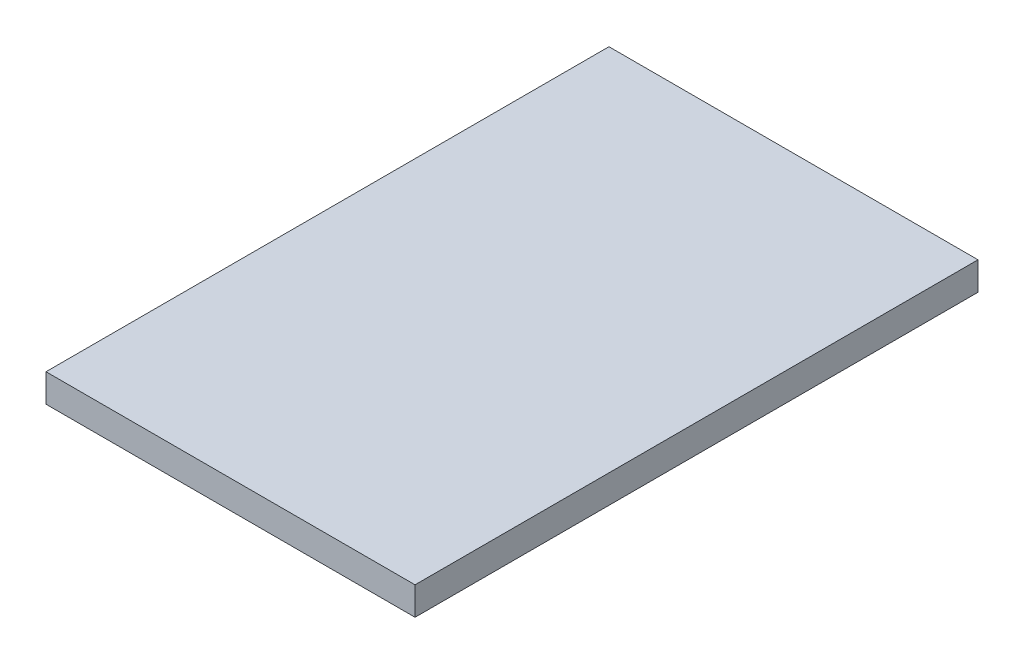
ISO-10303-21;
HEADER;
FILE_DESCRIPTION(('STEP AP214'),'2;1');
FILE_NAME('part.step','',(''),(''),'','','');
FILE_SCHEMA(('AUTOMOTIVE_DESIGN { 1 0 10303 214 1 1 1 1 }'));
ENDSEC;
DATA;
#1=APPLICATION_CONTEXT('core data for automotive mechanical design processes');
#2=APPLICATION_PROTOCOL_DEFINITION('international standard','automotive_design',2000,#1);
#3=PRODUCT_CONTEXT('',#1,'mechanical');
#4=PRODUCT('Part','Part','',(#3));
#5=PRODUCT_RELATED_PRODUCT_CATEGORY('part','',(#4));
#6=PRODUCT_DEFINITION_FORMATION('','',#4);
#7=PRODUCT_DEFINITION_CONTEXT('part definition',#1,'design');
#8=PRODUCT_DEFINITION('design','',#6,#7);
#9=PRODUCT_DEFINITION_SHAPE('','',#8);
#10=(LENGTH_UNIT() NAMED_UNIT(*) SI_UNIT(.MILLI.,.METRE.));
#11=(NAMED_UNIT(*) PLANE_ANGLE_UNIT() SI_UNIT($,.RADIAN.));
#12=(NAMED_UNIT(*) SI_UNIT($,.STERADIAN.) SOLID_ANGLE_UNIT());
#13=UNCERTAINTY_MEASURE_WITH_UNIT(LENGTH_MEASURE(1.E-05),#10,'distance_accuracy_value','');
#14=(GEOMETRIC_REPRESENTATION_CONTEXT(3) GLOBAL_UNCERTAINTY_ASSIGNED_CONTEXT((#13)) GLOBAL_UNIT_ASSIGNED_CONTEXT((#10,
#11,#12)) REPRESENTATION_CONTEXT('',''));
#15=CARTESIAN_POINT('',(0.,0.,0.));
#16=DIRECTION('',(0.,0.,1.));
#17=DIRECTION('',(1.,0.,0.));
#18=AXIS2_PLACEMENT_3D('',#15,#16,#17);
#19=CARTESIAN_POINT('',(118.,18.,-180.));
#20=DIRECTION('',(-1.,0.,0.));
#21=DIRECTION('',(0.,0.,1.));
#22=AXIS2_PLACEMENT_3D('',#19,#20,#21);
#23=PLANE('',#22);
#24=DIRECTION('',(0.,0.,-1.));
#25=VECTOR('',#24,1.);
#26=CARTESIAN_POINT('',(118.,0.,-180.));
#27=LINE('',#26,#25);
#28=CARTESIAN_POINT('',(118.,0.,180.));
#29=VERTEX_POINT('',#28);
#30=CARTESIAN_POINT('',(118.,0.,-180.));
#31=VERTEX_POINT('',#30);
#32=EDGE_CURVE('E95',#29,#31,#27,.T.);
#33=ORIENTED_EDGE('',*,*,#32,.T.);
#34=DIRECTION('',(0.,-1.,0.));
#35=VECTOR('',#34,1.);
#36=CARTESIAN_POINT('',(118.,18.,-180.));
#37=LINE('',#36,#35);
#38=CARTESIAN_POINT('',(118.,18.,-180.));
#39=VERTEX_POINT('',#38);
#40=EDGE_CURVE('E11',#39,#31,#37,.T.);
#41=ORIENTED_EDGE('',*,*,#40,.F.);
#42=DIRECTION('',(0.,0.,-1.));
#43=VECTOR('',#42,1.);
#44=CARTESIAN_POINT('',(118.,18.,-180.));
#45=LINE('',#44,#43);
#46=CARTESIAN_POINT('',(118.,18.,180.));
#47=VERTEX_POINT('',#46);
#48=EDGE_CURVE('E83',#47,#39,#45,.T.);
#49=ORIENTED_EDGE('',*,*,#48,.F.);
#50=DIRECTION('',(0.,-1.,0.));
#51=VECTOR('',#50,1.);
#52=CARTESIAN_POINT('',(118.,18.,180.));
#53=LINE('',#52,#51);
#54=EDGE_CURVE('E91',#47,#29,#53,.T.);
#55=ORIENTED_EDGE('',*,*,#54,.T.);
#56=EDGE_LOOP('',(#33,#41,#49,#55));
#57=FACE_BOUND('',#56,.T.);
#58=ADVANCED_FACE('F32',(#57),#23,.F.);
#59=CARTESIAN_POINT('',(-118.,18.,-180.));
#60=DIRECTION('',(0.,0.,1.));
#61=DIRECTION('',(1.,0.,0.));
#62=AXIS2_PLACEMENT_3D('',#59,#60,#61);
#63=PLANE('',#62);
#64=DIRECTION('',(-1.,0.,0.));
#65=VECTOR('',#64,1.);
#66=CARTESIAN_POINT('',(-118.,0.,-180.));
#67=LINE('',#66,#65);
#68=CARTESIAN_POINT('',(-118.,0.,-180.));
#69=VERTEX_POINT('',#68);
#70=EDGE_CURVE('E87',#31,#69,#67,.T.);
#71=ORIENTED_EDGE('',*,*,#70,.T.);
#72=DIRECTION('',(0.,-1.,0.));
#73=VECTOR('',#72,1.);
#74=CARTESIAN_POINT('',(-118.,18.,-180.));
#75=LINE('',#74,#73);
#76=CARTESIAN_POINT('',(-118.,18.,-180.));
#77=VERTEX_POINT('',#76);
#78=EDGE_CURVE('E40',#77,#69,#75,.T.);
#79=ORIENTED_EDGE('',*,*,#78,.F.);
#80=DIRECTION('',(-1.,0.,0.));
#81=VECTOR('',#80,1.);
#82=CARTESIAN_POINT('',(-118.,18.,-180.));
#83=LINE('',#82,#81);
#84=EDGE_CURVE('E78',#39,#77,#83,.T.);
#85=ORIENTED_EDGE('',*,*,#84,.F.);
#86=ORIENTED_EDGE('',*,*,#40,.T.);
#87=EDGE_LOOP('',(#71,#79,#85,#86));
#88=FACE_BOUND('',#87,.T.);
#89=ADVANCED_FACE('F86',(#88),#63,.F.);
#90=CARTESIAN_POINT('',(-118.,18.,-180.));
#91=DIRECTION('',(1.,0.,0.));
#92=DIRECTION('',(0.,0.,-1.));
#93=AXIS2_PLACEMENT_3D('',#90,#91,#92);
#94=PLANE('',#93);
#95=DIRECTION('',(0.,0.,1.));
#96=VECTOR('',#95,1.);
#97=CARTESIAN_POINT('',(-118.,0.,-180.));
#98=LINE('',#97,#96);
#99=CARTESIAN_POINT('',(-118.,0.,180.));
#100=VERTEX_POINT('',#99);
#101=EDGE_CURVE('E65',#69,#100,#98,.T.);
#102=ORIENTED_EDGE('',*,*,#101,.T.);
#103=DIRECTION('',(0.,-1.,0.));
#104=VECTOR('',#103,1.);
#105=CARTESIAN_POINT('',(-118.,18.,180.));
#106=LINE('',#105,#104);
#107=CARTESIAN_POINT('',(-118.,18.,180.));
#108=VERTEX_POINT('',#107);
#109=EDGE_CURVE('E88',#108,#100,#106,.T.);
#110=ORIENTED_EDGE('',*,*,#109,.F.);
#111=DIRECTION('',(0.,0.,1.));
#112=VECTOR('',#111,1.);
#113=CARTESIAN_POINT('',(-118.,18.,-180.));
#114=LINE('',#113,#112);
#115=EDGE_CURVE('E81',#77,#108,#114,.T.);
#116=ORIENTED_EDGE('',*,*,#115,.F.);
#117=ORIENTED_EDGE('',*,*,#78,.T.);
#118=EDGE_LOOP('',(#102,#110,#116,#117));
#119=FACE_BOUND('',#118,.T.);
#120=ADVANCED_FACE('F89',(#119),#94,.F.);
#121=CARTESIAN_POINT('',(-118.,18.,180.));
#122=DIRECTION('',(0.,0.,-1.));
#123=DIRECTION('',(-1.,0.,0.));
#124=AXIS2_PLACEMENT_3D('',#121,#122,#123);
#125=PLANE('',#124);
#126=DIRECTION('',(1.,0.,0.));
#127=VECTOR('',#126,1.);
#128=CARTESIAN_POINT('',(-118.,0.,180.));
#129=LINE('',#128,#127);
#130=EDGE_CURVE('E71',#100,#29,#129,.T.);
#131=ORIENTED_EDGE('',*,*,#130,.T.);
#132=ORIENTED_EDGE('',*,*,#54,.F.);
#133=DIRECTION('',(1.,0.,0.));
#134=VECTOR('',#133,1.);
#135=CARTESIAN_POINT('',(-118.,18.,180.));
#136=LINE('',#135,#134);
#137=EDGE_CURVE('E48',#108,#47,#136,.T.);
#138=ORIENTED_EDGE('',*,*,#137,.F.);
#139=ORIENTED_EDGE('',*,*,#109,.T.);
#140=EDGE_LOOP('',(#131,#132,#138,#139));
#141=FACE_BOUND('',#140,.T.);
#142=ADVANCED_FACE('F102',(#141),#125,.F.);
#143=CARTESIAN_POINT('',(0.,18.,0.));
#144=DIRECTION('',(0.,1.,0.));
#145=DIRECTION('',(0.,0.,1.));
#146=AXIS2_PLACEMENT_3D('',#143,#144,#145);
#147=PLANE('',#146);
#148=ORIENTED_EDGE('',*,*,#48,.T.);
#149=ORIENTED_EDGE('',*,*,#84,.T.);
#150=ORIENTED_EDGE('',*,*,#115,.T.);
#151=ORIENTED_EDGE('',*,*,#137,.T.);
#152=EDGE_LOOP('',(#148,#149,#150,#151));
#153=FACE_BOUND('',#152,.T.);
#154=ADVANCED_FACE('F79',(#153),#147,.T.);
#155=CARTESIAN_POINT('',(0.,0.,0.));
#156=DIRECTION('',(0.,1.,0.));
#157=DIRECTION('',(0.,0.,1.));
#158=AXIS2_PLACEMENT_3D('',#155,#156,#157);
#159=PLANE('',#158);
#160=ORIENTED_EDGE('',*,*,#32,.F.);
#161=ORIENTED_EDGE('',*,*,#130,.F.);
#162=ORIENTED_EDGE('',*,*,#101,.F.);
#163=ORIENTED_EDGE('',*,*,#70,.F.);
#164=EDGE_LOOP('',(#160,#161,#162,#163));
#165=FACE_BOUND('',#164,.T.);
#166=ADVANCED_FACE('F105',(#165),#159,.F.);
#167=CLOSED_SHELL('',(#58,#89,#120,#142,#154,#166));
#168=MANIFOLD_SOLID_BREP('B2',#167);
#169=ADVANCED_BREP_SHAPE_REPRESENTATION('',(#18,#168),#14);
#170=SHAPE_DEFINITION_REPRESENTATION(#9,#169);
ENDSEC;
END-ISO-10303-21;
